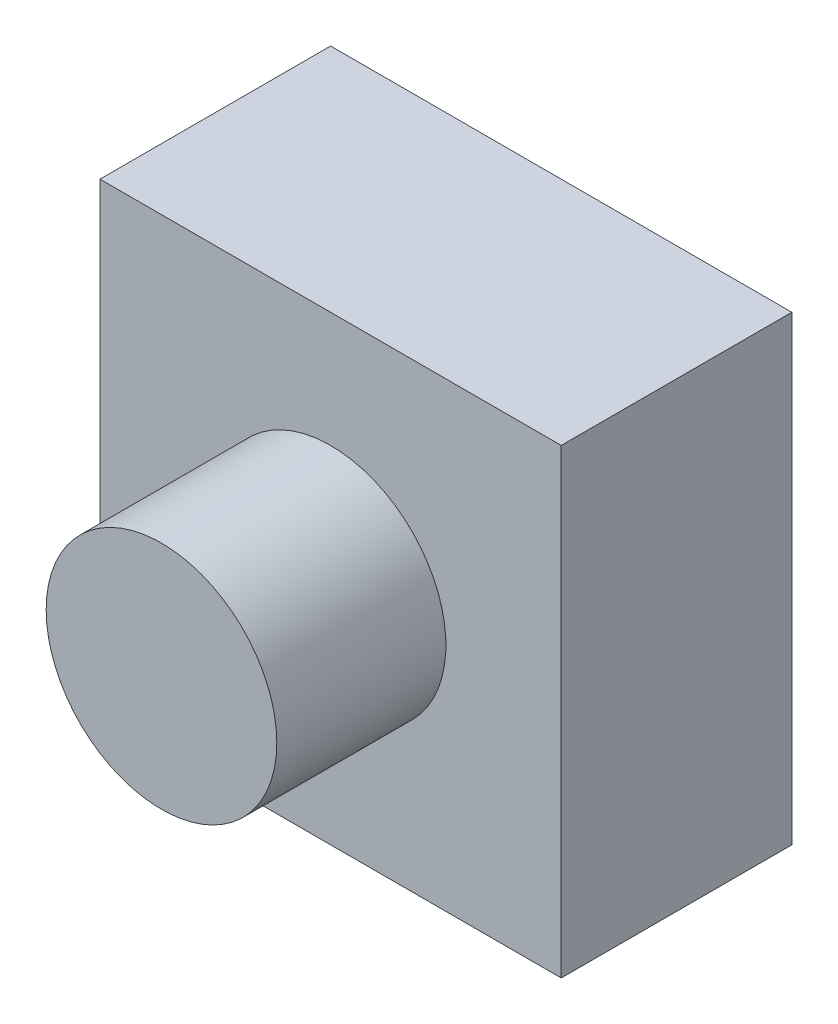
ISO-10303-21;
HEADER;
FILE_DESCRIPTION(('STEP AP214'),'2;1');
FILE_NAME('part.step','',(''),(''),'','','');
FILE_SCHEMA(('AUTOMOTIVE_DESIGN { 1 0 10303 214 1 1 1 1 }'));
ENDSEC;
DATA;
#1=APPLICATION_CONTEXT('core data for automotive mechanical design processes');
#2=APPLICATION_PROTOCOL_DEFINITION('international standard','automotive_design',2000,#1);
#3=PRODUCT_CONTEXT('',#1,'mechanical');
#4=PRODUCT('Part','Part','',(#3));
#5=PRODUCT_RELATED_PRODUCT_CATEGORY('part','',(#4));
#6=PRODUCT_DEFINITION_FORMATION('','',#4);
#7=PRODUCT_DEFINITION_CONTEXT('part definition',#1,'design');
#8=PRODUCT_DEFINITION('design','',#6,#7);
#9=PRODUCT_DEFINITION_SHAPE('','',#8);
#10=(LENGTH_UNIT() NAMED_UNIT(*) SI_UNIT(.MILLI.,.METRE.));
#11=(NAMED_UNIT(*) PLANE_ANGLE_UNIT() SI_UNIT($,.RADIAN.));
#12=(NAMED_UNIT(*) SI_UNIT($,.STERADIAN.) SOLID_ANGLE_UNIT());
#13=UNCERTAINTY_MEASURE_WITH_UNIT(LENGTH_MEASURE(1.E-05),#10,'distance_accuracy_value','');
#14=(GEOMETRIC_REPRESENTATION_CONTEXT(3) GLOBAL_UNCERTAINTY_ASSIGNED_CONTEXT((#13)) GLOBAL_UNIT_ASSIGNED_CONTEXT((#10,
#11,#12)) REPRESENTATION_CONTEXT('',''));
#15=CARTESIAN_POINT('',(0.,0.,0.));
#16=DIRECTION('',(0.,0.,1.));
#17=DIRECTION('',(1.,0.,0.));
#18=AXIS2_PLACEMENT_3D('',#15,#16,#17);
#19=CARTESIAN_POINT('',(0.,0.,3.));
#20=DIRECTION('',(0.,0.,-1.));
#21=DIRECTION('',(-1.,0.,0.));
#22=AXIS2_PLACEMENT_3D('',#19,#20,#21);
#23=PLANE('',#22);
#24=DIRECTION('',(0.,1.,0.));
#25=VECTOR('',#24,1.);
#26=CARTESIAN_POINT('',(3.,-3.,3.));
#27=LINE('',#26,#25);
#28=CARTESIAN_POINT('',(3.,-3.,3.));
#29=VERTEX_POINT('',#28);
#30=CARTESIAN_POINT('',(3.,3.,3.));
#31=VERTEX_POINT('',#30);
#32=EDGE_CURVE('E86',#29,#31,#27,.T.);
#33=ORIENTED_EDGE('',*,*,#32,.T.);
#34=DIRECTION('',(-1.,0.,0.));
#35=VECTOR('',#34,1.);
#36=CARTESIAN_POINT('',(-3.,3.,3.));
#37=LINE('',#36,#35);
#38=CARTESIAN_POINT('',(-3.,3.,3.));
#39=VERTEX_POINT('',#38);
#40=EDGE_CURVE('E81',#31,#39,#37,.T.);
#41=ORIENTED_EDGE('',*,*,#40,.T.);
#42=DIRECTION('',(0.,-1.,0.));
#43=VECTOR('',#42,1.);
#44=CARTESIAN_POINT('',(-3.,-3.,3.));
#45=LINE('',#44,#43);
#46=CARTESIAN_POINT('',(-3.,-3.,3.));
#47=VERTEX_POINT('',#46);
#48=EDGE_CURVE('E84',#39,#47,#45,.T.);
#49=ORIENTED_EDGE('',*,*,#48,.T.);
#50=DIRECTION('',(1.,0.,0.));
#51=VECTOR('',#50,1.);
#52=CARTESIAN_POINT('',(-3.,-3.,3.));
#53=LINE('',#52,#51);
#54=EDGE_CURVE('E50',#47,#29,#53,.T.);
#55=ORIENTED_EDGE('',*,*,#54,.T.);
#56=EDGE_LOOP('',(#33,#41,#49,#55));
#57=FACE_BOUND('',#56,.T.);
#58=CARTESIAN_POINT('',(0.,0.,3.));
#59=DIRECTION('',(0.,0.,-1.));
#60=DIRECTION('',(-1.,0.,0.));
#61=AXIS2_PLACEMENT_3D('',#58,#59,#60);
#62=CIRCLE('',#61,1.5);
#63=CARTESIAN_POINT('',(-1.5,0.,3.));
#64=VERTEX_POINT('',#63);
#65=EDGE_CURVE('E11',#64,#64,#62,.F.);
#66=ORIENTED_EDGE('',*,*,#65,.F.);
#67=EDGE_LOOP('',(#66));
#68=FACE_BOUND('',#67,.T.);
#69=ADVANCED_FACE('F33',(#57,#68),#23,.F.);
#70=CARTESIAN_POINT('',(3.,-3.,3.));
#71=DIRECTION('',(-1.,0.,0.));
#72=DIRECTION('',(0.,0.,1.));
#73=AXIS2_PLACEMENT_3D('',#70,#71,#72);
#74=PLANE('',#73);
#75=DIRECTION('',(0.,1.,0.));
#76=VECTOR('',#75,1.);
#77=CARTESIAN_POINT('',(3.,-3.,0.));
#78=LINE('',#77,#76);
#79=CARTESIAN_POINT('',(3.,-3.,0.));
#80=VERTEX_POINT('',#79);
#81=CARTESIAN_POINT('',(3.,3.,0.));
#82=VERTEX_POINT('',#81);
#83=EDGE_CURVE('E100',#80,#82,#78,.T.);
#84=ORIENTED_EDGE('',*,*,#83,.T.);
#85=DIRECTION('',(0.,0.,-1.));
#86=VECTOR('',#85,1.);
#87=CARTESIAN_POINT('',(3.,3.,3.));
#88=LINE('',#87,#86);
#89=EDGE_CURVE('E42',#31,#82,#88,.T.);
#90=ORIENTED_EDGE('',*,*,#89,.F.);
#91=ORIENTED_EDGE('',*,*,#32,.F.);
#92=DIRECTION('',(0.,0.,-1.));
#93=VECTOR('',#92,1.);
#94=CARTESIAN_POINT('',(3.,-3.,3.));
#95=LINE('',#94,#93);
#96=EDGE_CURVE('E96',#29,#80,#95,.T.);
#97=ORIENTED_EDGE('',*,*,#96,.T.);
#98=EDGE_LOOP('',(#84,#90,#91,#97));
#99=FACE_BOUND('',#98,.T.);
#100=ADVANCED_FACE('F35',(#99),#74,.F.);
#101=CARTESIAN_POINT('',(-3.,3.,3.));
#102=DIRECTION('',(0.,-1.,0.));
#103=DIRECTION('',(0.,0.,-1.));
#104=AXIS2_PLACEMENT_3D('',#101,#102,#103);
#105=PLANE('',#104);
#106=DIRECTION('',(-1.,0.,0.));
#107=VECTOR('',#106,1.);
#108=CARTESIAN_POINT('',(-3.,3.,0.));
#109=LINE('',#108,#107);
#110=CARTESIAN_POINT('',(-3.,3.,0.));
#111=VERTEX_POINT('',#110);
#112=EDGE_CURVE('E91',#82,#111,#109,.T.);
#113=ORIENTED_EDGE('',*,*,#112,.T.);
#114=DIRECTION('',(0.,0.,-1.));
#115=VECTOR('',#114,1.);
#116=CARTESIAN_POINT('',(-3.,3.,3.));
#117=LINE('',#116,#115);
#118=EDGE_CURVE('E89',#39,#111,#117,.T.);
#119=ORIENTED_EDGE('',*,*,#118,.F.);
#120=ORIENTED_EDGE('',*,*,#40,.F.);
#121=ORIENTED_EDGE('',*,*,#89,.T.);
#122=EDGE_LOOP('',(#113,#119,#120,#121));
#123=FACE_BOUND('',#122,.T.);
#124=ADVANCED_FACE('F90',(#123),#105,.F.);
#125=CARTESIAN_POINT('',(-3.,-3.,3.));
#126=DIRECTION('',(1.,0.,0.));
#127=DIRECTION('',(0.,0.,-1.));
#128=AXIS2_PLACEMENT_3D('',#125,#126,#127);
#129=PLANE('',#128);
#130=DIRECTION('',(0.,-1.,0.));
#131=VECTOR('',#130,1.);
#132=CARTESIAN_POINT('',(-3.,-3.,0.));
#133=LINE('',#132,#131);
#134=CARTESIAN_POINT('',(-3.,-3.,0.));
#135=VERTEX_POINT('',#134);
#136=EDGE_CURVE('E67',#111,#135,#133,.T.);
#137=ORIENTED_EDGE('',*,*,#136,.T.);
#138=DIRECTION('',(0.,0.,-1.));
#139=VECTOR('',#138,1.);
#140=CARTESIAN_POINT('',(-3.,-3.,3.));
#141=LINE('',#140,#139);
#142=EDGE_CURVE('E92',#47,#135,#141,.T.);
#143=ORIENTED_EDGE('',*,*,#142,.F.);
#144=ORIENTED_EDGE('',*,*,#48,.F.);
#145=ORIENTED_EDGE('',*,*,#118,.T.);
#146=EDGE_LOOP('',(#137,#143,#144,#145));
#147=FACE_BOUND('',#146,.T.);
#148=ADVANCED_FACE('F94',(#147),#129,.F.);
#149=CARTESIAN_POINT('',(-3.,-3.,3.));
#150=DIRECTION('',(0.,1.,0.));
#151=DIRECTION('',(0.,0.,1.));
#152=AXIS2_PLACEMENT_3D('',#149,#150,#151);
#153=PLANE('',#152);
#154=DIRECTION('',(1.,0.,0.));
#155=VECTOR('',#154,1.);
#156=CARTESIAN_POINT('',(-3.,-3.,0.));
#157=LINE('',#156,#155);
#158=EDGE_CURVE('E73',#135,#80,#157,.T.);
#159=ORIENTED_EDGE('',*,*,#158,.T.);
#160=ORIENTED_EDGE('',*,*,#96,.F.);
#161=ORIENTED_EDGE('',*,*,#54,.F.);
#162=ORIENTED_EDGE('',*,*,#142,.T.);
#163=EDGE_LOOP('',(#159,#160,#161,#162));
#164=FACE_BOUND('',#163,.T.);
#165=ADVANCED_FACE('F114',(#164),#153,.F.);
#166=CARTESIAN_POINT('',(0.,0.,0.));
#167=DIRECTION('',(0.,0.,-1.));
#168=DIRECTION('',(-1.,0.,0.));
#169=AXIS2_PLACEMENT_3D('',#166,#167,#168);
#170=PLANE('',#169);
#171=ORIENTED_EDGE('',*,*,#83,.F.);
#172=ORIENTED_EDGE('',*,*,#158,.F.);
#173=ORIENTED_EDGE('',*,*,#136,.F.);
#174=ORIENTED_EDGE('',*,*,#112,.F.);
#175=EDGE_LOOP('',(#171,#172,#173,#174));
#176=FACE_BOUND('',#175,.T.);
#177=ADVANCED_FACE('F111',(#176),#170,.T.);
#178=CARTESIAN_POINT('',(0.,0.,5.2));
#179=DIRECTION('',(0.,0.,-1.));
#180=DIRECTION('',(-1.,0.,0.));
#181=AXIS2_PLACEMENT_3D('',#178,#179,#180);
#182=CYLINDRICAL_SURFACE('',#181,1.5);
#183=CARTESIAN_POINT('',(0.,0.,5.2));
#184=DIRECTION('',(0.,0.,1.));
#185=DIRECTION('',(1.,0.,0.));
#186=AXIS2_PLACEMENT_3D('',#183,#184,#185);
#187=CIRCLE('',#186,1.5);
#188=CARTESIAN_POINT('',(1.5,0.,5.2));
#189=VERTEX_POINT('',#188);
#190=EDGE_CURVE('E103',#189,#189,#187,.T.);
#191=ORIENTED_EDGE('',*,*,#190,.F.);
#192=EDGE_LOOP('',(#191));
#193=FACE_BOUND('',#192,.T.);
#194=ORIENTED_EDGE('',*,*,#65,.T.);
#195=EDGE_LOOP('',(#194));
#196=FACE_BOUND('',#195,.T.);
#197=ADVANCED_FACE('F113',(#193,#196),#182,.T.);
#198=CARTESIAN_POINT('',(0.,0.,5.2));
#199=DIRECTION('',(0.,0.,1.));
#200=DIRECTION('',(1.,0.,0.));
#201=AXIS2_PLACEMENT_3D('',#198,#199,#200);
#202=PLANE('',#201);
#203=ORIENTED_EDGE('',*,*,#190,.T.);
#204=EDGE_LOOP('',(#203));
#205=FACE_BOUND('',#204,.T.);
#206=ADVANCED_FACE('F120',(#205),#202,.T.);
#207=CLOSED_SHELL('',(#69,#100,#124,#148,#165,#177,#197,#206));
#208=MANIFOLD_SOLID_BREP('B2',#207);
#209=ADVANCED_BREP_SHAPE_REPRESENTATION('',(#18,#208),#14);
#210=SHAPE_DEFINITION_REPRESENTATION(#9,#209);
ENDSEC;
END-ISO-10303-21;
